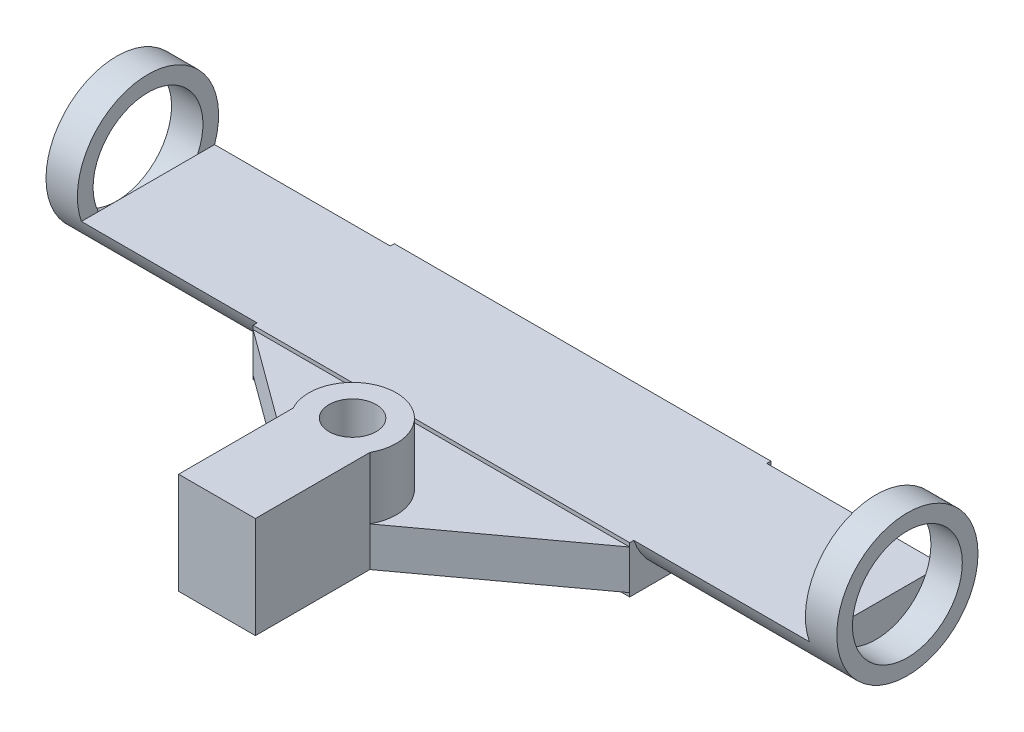
ISO-10303-21;
HEADER;
FILE_DESCRIPTION(('STEP AP214'),'2;1');
FILE_NAME('part.step','',(''),(''),'','','');
FILE_SCHEMA(('AUTOMOTIVE_DESIGN { 1 0 10303 214 1 1 1 1 }'));
ENDSEC;
DATA;
#1=APPLICATION_CONTEXT('core data for automotive mechanical design processes');
#2=APPLICATION_PROTOCOL_DEFINITION('international standard','automotive_design',2000,#1);
#3=PRODUCT_CONTEXT('',#1,'mechanical');
#4=PRODUCT('Part','Part','',(#3));
#5=PRODUCT_RELATED_PRODUCT_CATEGORY('part','',(#4));
#6=PRODUCT_DEFINITION_FORMATION('','',#4);
#7=PRODUCT_DEFINITION_CONTEXT('part definition',#1,'design');
#8=PRODUCT_DEFINITION('design','',#6,#7);
#9=PRODUCT_DEFINITION_SHAPE('','',#8);
#10=(LENGTH_UNIT() NAMED_UNIT(*) SI_UNIT(.MILLI.,.METRE.));
#11=(NAMED_UNIT(*) PLANE_ANGLE_UNIT() SI_UNIT($,.RADIAN.));
#12=(NAMED_UNIT(*) SI_UNIT($,.STERADIAN.) SOLID_ANGLE_UNIT());
#13=UNCERTAINTY_MEASURE_WITH_UNIT(LENGTH_MEASURE(1.E-05),#10,'distance_accuracy_value','');
#14=(GEOMETRIC_REPRESENTATION_CONTEXT(3) GLOBAL_UNCERTAINTY_ASSIGNED_CONTEXT((#13)) GLOBAL_UNIT_ASSIGNED_CONTEXT((#10,
#11,#12)) REPRESENTATION_CONTEXT('',''));
#15=CARTESIAN_POINT('',(0.,0.,0.));
#16=DIRECTION('',(0.,0.,1.));
#17=DIRECTION('',(1.,0.,0.));
#18=AXIS2_PLACEMENT_3D('',#15,#16,#17);
#19=CARTESIAN_POINT('',(59.217620347765,28.575,23.8423003272837));
#20=DIRECTION('',(0.,0.,-1.));
#21=DIRECTION('',(-1.,0.,0.));
#22=AXIS2_PLACEMENT_3D('',#19,#20,#21);
#23=PLANE('',#22);
#24=DIRECTION('',(0.,1.,0.));
#25=VECTOR('',#24,1.);
#26=CARTESIAN_POINT('',(-58.882379652235,28.575,23.8423003272837));
#27=LINE('',#26,#25);
#28=CARTESIAN_POINT('',(-58.882379652235,0.,23.8423003272837));
#29=VERTEX_POINT('',#28);
#30=CARTESIAN_POINT('',(-58.882379652235,0.762500000000017,23.8423003272837));
#31=VERTEX_POINT('',#30);
#32=EDGE_CURVE('E243',#29,#31,#27,.T.);
#33=ORIENTED_EDGE('',*,*,#32,.F.);
#34=DIRECTION('',(1.,0.,0.));
#35=VECTOR('',#34,1.);
#36=CARTESIAN_POINT('',(59.217620347765,0.,23.8423003272837));
#37=LINE('',#36,#35);
#38=CARTESIAN_POINT('',(17.317620347765,0.,23.8423003272837));
#39=VERTEX_POINT('',#38);
#40=EDGE_CURVE('E198',#29,#39,#37,.T.);
#41=ORIENTED_EDGE('',*,*,#40,.T.);
#42=DIRECTION('',(0.,-1.,0.));
#43=VECTOR('',#42,1.);
#44=CARTESIAN_POINT('',(17.317620347765,28.575,23.8423003272837));
#45=LINE('',#44,#43);
#46=CARTESIAN_POINT('',(17.317620347765,0.762500000000024,23.8423003272837));
#47=VERTEX_POINT('',#46);
#48=EDGE_CURVE('E259',#47,#39,#45,.T.);
#49=ORIENTED_EDGE('',*,*,#48,.F.);
#50=DIRECTION('',(1.,0.,0.));
#51=VECTOR('',#50,1.);
#52=CARTESIAN_POINT('',(17.317620347765,0.762500000000026,23.8423003272837));
#53=LINE('',#52,#51);
#54=EDGE_CURVE('E322',#31,#47,#53,.T.);
#55=ORIENTED_EDGE('',*,*,#54,.F.);
#56=EDGE_LOOP('',(#33,#41,#49,#55));
#57=FACE_BOUND('',#56,.T.);
#58=ADVANCED_FACE('F34',(#57),#23,.F.);
#59=CARTESIAN_POINT('',(-58.882379652235,8.76250000000002,23.8423003272837));
#60=VERTEX_POINT('',#59);
#61=CARTESIAN_POINT('',(-58.882379652235,9.525,23.8423003272837));
#62=VERTEX_POINT('',#61);
#63=EDGE_CURVE('E237',#60,#62,#27,.T.);
#64=ORIENTED_EDGE('',*,*,#63,.F.);
#65=DIRECTION('',(-1.,0.,0.));
#66=VECTOR('',#65,1.);
#67=CARTESIAN_POINT('',(17.317620347765,8.76250000000003,23.8423003272837));
#68=LINE('',#67,#66);
#69=CARTESIAN_POINT('',(17.317620347765,8.76250000000003,23.8423003272837));
#70=VERTEX_POINT('',#69);
#71=EDGE_CURVE('E185',#70,#60,#68,.T.);
#72=ORIENTED_EDGE('',*,*,#71,.F.);
#73=CARTESIAN_POINT('',(17.317620347765,9.525,23.8423003272837));
#74=VERTEX_POINT('',#73);
#75=EDGE_CURVE('E266',#74,#70,#45,.T.);
#76=ORIENTED_EDGE('',*,*,#75,.F.);
#77=DIRECTION('',(1.,0.,0.));
#78=VECTOR('',#77,1.);
#79=CARTESIAN_POINT('',(-94.432379652235,9.525,23.8423003272837));
#80=LINE('',#79,#78);
#81=EDGE_CURVE('E182',#62,#74,#80,.T.);
#82=ORIENTED_EDGE('',*,*,#81,.F.);
#83=EDGE_LOOP('',(#64,#72,#76,#82));
#84=FACE_BOUND('',#83,.T.);
#85=ADVANCED_FACE('F337',(#84),#23,.F.);
#86=CARTESIAN_POINT('',(59.217620347765,28.575,-4.73269967271635));
#87=DIRECTION('',(0.,0.,1.));
#88=DIRECTION('',(1.,0.,0.));
#89=AXIS2_PLACEMENT_3D('',#86,#87,#88);
#90=PLANE('',#89);
#91=DIRECTION('',(0.,-1.,0.));
#92=VECTOR('',#91,1.);
#93=CARTESIAN_POINT('',(-58.882379652235,28.575,-4.73269967271634));
#94=LINE('',#93,#92);
#95=CARTESIAN_POINT('',(-58.882379652235,9.525,-4.73269967271635));
#96=VERTEX_POINT('',#95);
#97=CARTESIAN_POINT('',(-58.882379652235,0.,-4.73269967271634));
#98=VERTEX_POINT('',#97);
#99=EDGE_CURVE('E247',#96,#98,#94,.T.);
#100=ORIENTED_EDGE('',*,*,#99,.F.);
#101=DIRECTION('',(-1.,0.,0.));
#102=VECTOR('',#101,1.);
#103=CARTESIAN_POINT('',(-94.432379652235,9.525,-4.73269967271635));
#104=LINE('',#103,#102);
#105=CARTESIAN_POINT('',(17.317620347765,9.525,-4.73269967271635));
#106=VERTEX_POINT('',#105);
#107=EDGE_CURVE('E192',#106,#96,#104,.T.);
#108=ORIENTED_EDGE('',*,*,#107,.F.);
#109=DIRECTION('',(0.,1.,0.));
#110=VECTOR('',#109,1.);
#111=CARTESIAN_POINT('',(17.317620347765,28.575,-4.73269967271635));
#112=LINE('',#111,#110);
#113=CARTESIAN_POINT('',(17.317620347765,0.,-4.73269967271635));
#114=VERTEX_POINT('',#113);
#115=EDGE_CURVE('E269',#114,#106,#112,.T.);
#116=ORIENTED_EDGE('',*,*,#115,.F.);
#117=DIRECTION('',(-1.,0.,0.));
#118=VECTOR('',#117,1.);
#119=CARTESIAN_POINT('',(59.217620347765,0.,-4.73269967271635));
#120=LINE('',#119,#118);
#121=EDGE_CURVE('E195',#114,#98,#120,.T.);
#122=ORIENTED_EDGE('',*,*,#121,.T.);
#123=EDGE_LOOP('',(#100,#108,#116,#122));
#124=FACE_BOUND('',#123,.T.);
#125=ADVANCED_FACE('F381',(#124),#90,.F.);
#126=CARTESIAN_POINT('',(0.,0.,0.));
#127=DIRECTION('',(0.,1.,0.));
#128=DIRECTION('',(0.,0.,1.));
#129=AXIS2_PLACEMENT_3D('',#126,#127,#128);
#130=PLANE('',#129);
#131=DIRECTION('',(0.,0.,1.));
#132=VECTOR('',#131,1.);
#133=CARTESIAN_POINT('',(-58.882379652235,0.,0.));
#134=LINE('',#133,#132);
#135=CARTESIAN_POINT('',(-58.882379652235,0.,9.55480032728367));
#136=VERTEX_POINT('',#135);
#137=EDGE_CURVE('E249',#98,#136,#134,.T.);
#138=ORIENTED_EDGE('',*,*,#137,.F.);
#139=ORIENTED_EDGE('',*,*,#121,.F.);
#140=DIRECTION('',(0.,0.,-1.));
#141=VECTOR('',#140,1.);
#142=CARTESIAN_POINT('',(17.317620347765,0.,0.));
#143=LINE('',#142,#141);
#144=CARTESIAN_POINT('',(17.317620347765,0.,9.55480032728365));
#145=VERTEX_POINT('',#144);
#146=EDGE_CURVE('E268',#145,#114,#143,.T.);
#147=ORIENTED_EDGE('',*,*,#146,.F.);
#148=EDGE_CURVE('E265',#39,#145,#143,.T.);
#149=ORIENTED_EDGE('',*,*,#148,.F.);
#150=ORIENTED_EDGE('',*,*,#40,.F.);
#151=EDGE_CURVE('E251',#136,#29,#134,.T.);
#152=ORIENTED_EDGE('',*,*,#151,.F.);
#153=EDGE_LOOP('',(#138,#139,#147,#149,#150,#152));
#154=FACE_BOUND('',#153,.T.);
#155=ADVANCED_FACE('F385',(#154),#130,.F.);
#156=CARTESIAN_POINT('',(0.,9.525,0.));
#157=DIRECTION('',(0.,1.,0.));
#158=DIRECTION('',(0.,0.,1.));
#159=AXIS2_PLACEMENT_3D('',#156,#157,#158);
#160=PLANE('',#159);
#161=ORIENTED_EDGE('',*,*,#107,.T.);
#162=DIRECTION('',(0.,0.,1.));
#163=VECTOR('',#162,1.);
#164=CARTESIAN_POINT('',(-58.882379652235,9.525,0.));
#165=LINE('',#164,#163);
#166=CARTESIAN_POINT('',(-58.882379652235,9.525,-3.91558385432006));
#167=VERTEX_POINT('',#166);
#168=EDGE_CURVE('E246',#96,#167,#165,.T.);
#169=ORIENTED_EDGE('',*,*,#168,.T.);
#170=DIRECTION('',(-1.,0.,0.));
#171=VECTOR('',#170,1.);
#172=CARTESIAN_POINT('',(-58.882379652235,9.525,-3.91558385432006));
#173=LINE('',#172,#171);
#174=CARTESIAN_POINT('',(-94.432379652235,9.525,-3.91558385432006));
#175=VERTEX_POINT('',#174);
#176=EDGE_CURVE('E254',#167,#175,#173,.T.);
#177=ORIENTED_EDGE('',*,*,#176,.T.);
#178=DIRECTION('',(0.,0.,1.));
#179=VECTOR('',#178,1.);
#180=CARTESIAN_POINT('',(-94.432379652235,9.525,-4.73269967271635));
#181=LINE('',#180,#179);
#182=CARTESIAN_POINT('',(-94.432379652235,9.525,-0.485431243750938));
#183=VERTEX_POINT('',#182);
#184=EDGE_CURVE('E178',#175,#183,#181,.T.);
#185=ORIENTED_EDGE('',*,*,#184,.T.);
#186=CARTESIAN_POINT('',(-94.432379652235,9.525,19.5950318983183));
#187=VERTEX_POINT('',#186);
#188=EDGE_CURVE('E168',#183,#187,#181,.T.);
#189=ORIENTED_EDGE('',*,*,#188,.T.);
#190=CARTESIAN_POINT('',(-94.432379652235,9.525,23.0251845088874));
#191=VERTEX_POINT('',#190);
#192=EDGE_CURVE('E171',#187,#191,#181,.T.);
#193=ORIENTED_EDGE('',*,*,#192,.T.);
#194=DIRECTION('',(-1.,0.,0.));
#195=VECTOR('',#194,1.);
#196=CARTESIAN_POINT('',(-58.882379652235,9.525,23.0251845088874));
#197=LINE('',#196,#195);
#198=CARTESIAN_POINT('',(-58.882379652235,9.525,23.0251845088874));
#199=VERTEX_POINT('',#198);
#200=EDGE_CURVE('E252',#191,#199,#197,.F.);
#201=ORIENTED_EDGE('',*,*,#200,.T.);
#202=EDGE_CURVE('E242',#199,#62,#165,.T.);
#203=ORIENTED_EDGE('',*,*,#202,.T.);
#204=ORIENTED_EDGE('',*,*,#81,.T.);
#205=DIRECTION('',(0.,0.,-1.));
#206=VECTOR('',#205,1.);
#207=CARTESIAN_POINT('',(17.317620347765,9.525,0.));
#208=LINE('',#207,#206);
#209=CARTESIAN_POINT('',(17.317620347765,9.525,23.0251845088874));
#210=VERTEX_POINT('',#209);
#211=EDGE_CURVE('E218',#74,#210,#208,.T.);
#212=ORIENTED_EDGE('',*,*,#211,.T.);
#213=DIRECTION('',(1.,0.,0.));
#214=VECTOR('',#213,1.);
#215=CARTESIAN_POINT('',(17.317620347765,9.525,23.0251845088874));
#216=LINE('',#215,#214);
#217=CARTESIAN_POINT('',(52.867620347765,9.525,23.0251845088874));
#218=VERTEX_POINT('',#217);
#219=EDGE_CURVE('E42',#210,#218,#216,.T.);
#220=ORIENTED_EDGE('',*,*,#219,.T.);
#221=DIRECTION('',(0.,0.,-1.));
#222=VECTOR('',#221,1.);
#223=CARTESIAN_POINT('',(52.867620347765,9.525,-4.73269967271635));
#224=LINE('',#223,#222);
#225=CARTESIAN_POINT('',(52.867620347765,9.525,19.5950318983183));
#226=VERTEX_POINT('',#225);
#227=EDGE_CURVE('E189',#218,#226,#224,.T.);
#228=ORIENTED_EDGE('',*,*,#227,.T.);
#229=CARTESIAN_POINT('',(52.867620347765,9.525,-0.485431243750955));
#230=VERTEX_POINT('',#229);
#231=EDGE_CURVE('E193',#226,#230,#224,.T.);
#232=ORIENTED_EDGE('',*,*,#231,.T.);
#233=CARTESIAN_POINT('',(52.867620347765,9.525,-3.91558385432008));
#234=VERTEX_POINT('',#233);
#235=EDGE_CURVE('E188',#230,#234,#224,.T.);
#236=ORIENTED_EDGE('',*,*,#235,.T.);
#237=DIRECTION('',(1.,0.,0.));
#238=VECTOR('',#237,1.);
#239=CARTESIAN_POINT('',(17.317620347765,9.525,-3.91558385432008));
#240=LINE('',#239,#238);
#241=CARTESIAN_POINT('',(17.317620347765,9.525,-3.91558385432008));
#242=VERTEX_POINT('',#241);
#243=EDGE_CURVE('E206',#234,#242,#240,.F.);
#244=ORIENTED_EDGE('',*,*,#243,.T.);
#245=EDGE_CURVE('E271',#242,#106,#208,.T.);
#246=ORIENTED_EDGE('',*,*,#245,.T.);
#247=EDGE_LOOP('',(#161,#169,#177,#185,#189,#193,#201,#203,#204,#212,#220,#228,#232,#236,#244,#246));
#248=FACE_BOUND('',#247,.T.);
#249=ADVANCED_FACE('F180',(#248),#160,.T.);
#250=CARTESIAN_POINT('',(-94.432379652235,9.525,-4.73269967271635));
#251=DIRECTION('',(-1.,0.,0.));
#252=DIRECTION('',(0.,0.,1.));
#253=AXIS2_PLACEMENT_3D('',#250,#251,#252);
#254=PLANE('',#253);
#255=ORIENTED_EDGE('',*,*,#192,.F.);
#256=CARTESIAN_POINT('',(-94.432379652235,14.2875,9.55480032728367));
#257=DIRECTION('',(-1.,0.,0.));
#258=DIRECTION('',(0.,0.,1.));
#259=AXIS2_PLACEMENT_3D('',#256,#257,#258);
#260=CIRCLE('',#259,11.1125);
#261=EDGE_CURVE('E156',#183,#187,#260,.F.);
#262=ORIENTED_EDGE('',*,*,#261,.F.);
#263=ORIENTED_EDGE('',*,*,#184,.F.);
#264=CARTESIAN_POINT('',(-94.432379652235,14.2875,9.55480032728367));
#265=DIRECTION('',(-1.,0.,0.));
#266=DIRECTION('',(0.,0.,1.));
#267=AXIS2_PLACEMENT_3D('',#264,#265,#266);
#268=CIRCLE('',#267,14.2875);
#269=EDGE_CURVE('E12',#191,#175,#268,.T.);
#270=ORIENTED_EDGE('',*,*,#269,.F.);
#271=EDGE_LOOP('',(#255,#262,#263,#270));
#272=FACE_BOUND('',#271,.T.);
#273=ADVANCED_FACE('F172',(#272),#254,.F.);
#274=CARTESIAN_POINT('',(52.867620347765,9.525,-4.73269967271635));
#275=DIRECTION('',(1.,0.,0.));
#276=DIRECTION('',(0.,0.,-1.));
#277=AXIS2_PLACEMENT_3D('',#274,#275,#276);
#278=PLANE('',#277);
#279=ORIENTED_EDGE('',*,*,#235,.F.);
#280=CARTESIAN_POINT('',(52.867620347765,14.2875,9.55480032728365));
#281=DIRECTION('',(1.,0.,0.));
#282=DIRECTION('',(0.,0.,-1.));
#283=AXIS2_PLACEMENT_3D('',#280,#281,#282);
#284=CIRCLE('',#283,11.1125);
#285=EDGE_CURVE('E228',#226,#230,#284,.F.);
#286=ORIENTED_EDGE('',*,*,#285,.F.);
#287=ORIENTED_EDGE('',*,*,#227,.F.);
#288=CARTESIAN_POINT('',(52.867620347765,14.2875,9.55480032728365));
#289=DIRECTION('',(1.,0.,0.));
#290=DIRECTION('',(0.,0.,-1.));
#291=AXIS2_PLACEMENT_3D('',#288,#289,#290);
#292=CIRCLE('',#291,14.2875);
#293=EDGE_CURVE('E211',#234,#218,#292,.T.);
#294=ORIENTED_EDGE('',*,*,#293,.F.);
#295=EDGE_LOOP('',(#279,#286,#287,#294));
#296=FACE_BOUND('',#295,.T.);
#297=ADVANCED_FACE('F226',(#296),#278,.F.);
#298=CARTESIAN_POINT('',(17.317620347765,8.76250000000003,69.2423003272837));
#299=DIRECTION('',(0.,-1.,0.));
#300=DIRECTION('',(1.,0.,0.));
#301=AXIS2_PLACEMENT_3D('',#298,#299,#300);
#302=PLANE('',#301);
#303=CARTESIAN_POINT('',(-20.782379652235,8.76250000000002,41.8150044188641));
#304=DIRECTION('',(0.,1.,0.));
#305=DIRECTION('',(-1.,0.,0.));
#306=AXIS2_PLACEMENT_3D('',#303,#304,#305);
#307=CIRCLE('',#306,8.86020409158041);
#308=CARTESIAN_POINT('',(-13.0139213717516,8.76250000000002,46.0757875028578));
#309=VERTEX_POINT('',#308);
#310=CARTESIAN_POINT('',(-28.5508379327184,8.76250000000002,46.0757875028578));
#311=VERTEX_POINT('',#310);
#312=EDGE_CURVE('E277',#309,#311,#307,.T.);
#313=ORIENTED_EDGE('',*,*,#312,.F.);
#314=DIRECTION('',(-0.806527260869814,0.,0.591196902456225));
#315=VECTOR('',#314,1.);
#316=CARTESIAN_POINT('',(17.4211471524276,8.76250000000003,23.7664135851892));
#317=LINE('',#316,#315);
#318=EDGE_CURVE('E306',#70,#309,#317,.T.);
#319=ORIENTED_EDGE('',*,*,#318,.F.);
#320=ORIENTED_EDGE('',*,*,#71,.T.);
#321=DIRECTION('',(0.806527260869815,0.,0.591196902456224));
#322=VECTOR('',#321,1.);
#323=CARTESIAN_POINT('',(-31.9486031867236,8.76250000000002,43.5851732472716));
#324=LINE('',#323,#322);
#325=EDGE_CURVE('E297',#60,#311,#324,.T.);
#326=ORIENTED_EDGE('',*,*,#325,.T.);
#327=EDGE_LOOP('',(#313,#319,#320,#326));
#328=FACE_BOUND('',#327,.T.);
#329=ADVANCED_FACE('F332',(#328),#302,.F.);
#330=CARTESIAN_POINT('',(17.317620347765,0.762500000000026,69.2423003272837));
#331=DIRECTION('',(0.,1.,0.));
#332=DIRECTION('',(-1.,0.,0.));
#333=AXIS2_PLACEMENT_3D('',#330,#331,#332);
#334=PLANE('',#333);
#335=CARTESIAN_POINT('',(-20.782379652235,0.762500000000021,41.8150044188641));
#336=DIRECTION('',(0.,1.,0.));
#337=DIRECTION('',(-1.,0.,0.));
#338=AXIS2_PLACEMENT_3D('',#335,#336,#337);
#339=CIRCLE('',#338,4.7625);
#340=CARTESIAN_POINT('',(-25.544879652235,0.762500000000021,41.8150044188641));
#341=VERTEX_POINT('',#340);
#342=EDGE_CURVE('E207',#341,#341,#339,.T.);
#343=ORIENTED_EDGE('',*,*,#342,.T.);
#344=EDGE_LOOP('',(#343));
#345=FACE_BOUND('',#344,.T.);
#346=DIRECTION('',(0.806527260869814,0.,0.591196902456224));
#347=VECTOR('',#346,1.);
#348=CARTESIAN_POINT('',(12.3321358983811,0.762500000000025,76.0436369045983));
#349=LINE('',#348,#347);
#350=CARTESIAN_POINT('',(-28.5508379327184,0.76250000000002,46.0757875028578));
#351=VERTEX_POINT('',#350);
#352=EDGE_CURVE('E304',#31,#351,#349,.T.);
#353=ORIENTED_EDGE('',*,*,#352,.F.);
#354=ORIENTED_EDGE('',*,*,#54,.T.);
#355=DIRECTION('',(-0.806527260869814,0.,0.591196902456225));
#356=VECTOR('',#355,1.);
#357=CARTESIAN_POINT('',(-4.3298450463573,0.762500000000023,39.7102258245958));
#358=LINE('',#357,#356);
#359=CARTESIAN_POINT('',(-13.0139213717516,0.762500000000024,46.0757875028578));
#360=VERTEX_POINT('',#359);
#361=EDGE_CURVE('E315',#47,#360,#358,.T.);
#362=ORIENTED_EDGE('',*,*,#361,.T.);
#363=DIRECTION('',(0.,0.,1.));
#364=VECTOR('',#363,1.);
#365=CARTESIAN_POINT('',(-13.0139213717516,0.762500000000022,69.2423003272837));
#366=LINE('',#365,#364);
#367=CARTESIAN_POINT('',(-13.0139213717516,0.762500000000017,69.2423003272837));
#368=VERTEX_POINT('',#367);
#369=EDGE_CURVE('E312',#360,#368,#366,.T.);
#370=ORIENTED_EDGE('',*,*,#369,.T.);
#371=DIRECTION('',(1.,0.,0.));
#372=VECTOR('',#371,1.);
#373=CARTESIAN_POINT('',(17.317620347765,0.762500000000026,69.2423003272837));
#374=LINE('',#373,#372);
#375=CARTESIAN_POINT('',(-28.5508379327184,0.76250000000002,69.2423003272837));
#376=VERTEX_POINT('',#375);
#377=EDGE_CURVE('E176',#376,#368,#374,.T.);
#378=ORIENTED_EDGE('',*,*,#377,.F.);
#379=DIRECTION('',(0.,0.,1.));
#380=VECTOR('',#379,1.);
#381=CARTESIAN_POINT('',(-28.5508379327184,0.76250000000002,69.2423003272837));
#382=LINE('',#381,#380);
#383=EDGE_CURVE('E302',#351,#376,#382,.T.);
#384=ORIENTED_EDGE('',*,*,#383,.F.);
#385=EDGE_LOOP('',(#353,#354,#362,#370,#378,#384));
#386=FACE_BOUND('',#385,.T.);
#387=ADVANCED_FACE('F350',(#345,#386),#334,.F.);
#388=CARTESIAN_POINT('',(0.,0.,69.2423003272837));
#389=DIRECTION('',(0.,0.,1.));
#390=DIRECTION('',(1.,0.,0.));
#391=AXIS2_PLACEMENT_3D('',#388,#389,#390);
#392=PLANE('',#391);
#393=DIRECTION('',(0.,-1.,0.));
#394=VECTOR('',#393,1.);
#395=CARTESIAN_POINT('',(-13.0139213717516,0.,69.2423003272837));
#396=LINE('',#395,#394);
#397=CARTESIAN_POINT('',(-13.0139213717516,21.2875,69.2423003272837));
#398=VERTEX_POINT('',#397);
#399=EDGE_CURVE('E200',#398,#368,#396,.T.);
#400=ORIENTED_EDGE('',*,*,#399,.F.);
#401=DIRECTION('',(1.,0.,0.));
#402=VECTOR('',#401,1.);
#403=CARTESIAN_POINT('',(-28.5508379327184,21.2875,69.2423003272837));
#404=LINE('',#403,#402);
#405=CARTESIAN_POINT('',(-28.5508379327184,21.2875,69.2423003272837));
#406=VERTEX_POINT('',#405);
#407=EDGE_CURVE('E284',#406,#398,#404,.T.);
#408=ORIENTED_EDGE('',*,*,#407,.F.);
#409=DIRECTION('',(0.,-1.,0.));
#410=VECTOR('',#409,1.);
#411=CARTESIAN_POINT('',(-28.5508379327184,0.,69.2423003272837));
#412=LINE('',#411,#410);
#413=EDGE_CURVE('E203',#406,#376,#412,.T.);
#414=ORIENTED_EDGE('',*,*,#413,.T.);
#415=ORIENTED_EDGE('',*,*,#377,.T.);
#416=EDGE_LOOP('',(#400,#408,#414,#415));
#417=FACE_BOUND('',#416,.T.);
#418=ADVANCED_FACE('F353',(#417),#392,.T.);
#419=CARTESIAN_POINT('',(17.4211471524276,0.,23.7664135851892));
#420=DIRECTION('',(-0.591196902456225,0.,-0.806527260869814));
#421=DIRECTION('',(-0.806527260869814,0.,0.591196902456225));
#422=AXIS2_PLACEMENT_3D('',#419,#420,#421);
#423=PLANE('',#422);
#424=DIRECTION('',(0.,1.,0.));
#425=VECTOR('',#424,1.);
#426=CARTESIAN_POINT('',(17.317620347765,0.762500000000026,23.8423003272837));
#427=LINE('',#426,#425);
#428=EDGE_CURVE('E324',#47,#70,#427,.T.);
#429=ORIENTED_EDGE('',*,*,#428,.T.);
#430=ORIENTED_EDGE('',*,*,#318,.T.);
#431=DIRECTION('',(0.,1.,0.));
#432=VECTOR('',#431,1.);
#433=CARTESIAN_POINT('',(-13.0139213717516,0.,46.0757875028578));
#434=LINE('',#433,#432);
#435=EDGE_CURVE('E309',#360,#309,#434,.T.);
#436=ORIENTED_EDGE('',*,*,#435,.F.);
#437=ORIENTED_EDGE('',*,*,#361,.F.);
#438=EDGE_LOOP('',(#429,#430,#436,#437));
#439=FACE_BOUND('',#438,.T.);
#440=ADVANCED_FACE('F366',(#439),#423,.F.);
#441=CARTESIAN_POINT('',(-13.0139213717516,0.,0.));
#442=DIRECTION('',(-1.,0.,0.));
#443=DIRECTION('',(0.,0.,1.));
#444=AXIS2_PLACEMENT_3D('',#441,#442,#443);
#445=PLANE('',#444);
#446=ORIENTED_EDGE('',*,*,#435,.T.);
#447=DIRECTION('',(0.,-1.,0.));
#448=VECTOR('',#447,1.);
#449=CARTESIAN_POINT('',(-13.0139213717516,21.2875,46.0757875028578));
#450=LINE('',#449,#448);
#451=CARTESIAN_POINT('',(-13.0139213717516,21.2875,46.0757875028578));
#452=VERTEX_POINT('',#451);
#453=EDGE_CURVE('E289',#452,#309,#450,.T.);
#454=ORIENTED_EDGE('',*,*,#453,.F.);
#455=DIRECTION('',(0.,0.,-1.));
#456=VECTOR('',#455,1.);
#457=CARTESIAN_POINT('',(-13.0139213717516,21.2875,69.2423003272837));
#458=LINE('',#457,#456);
#459=EDGE_CURVE('E287',#398,#452,#458,.T.);
#460=ORIENTED_EDGE('',*,*,#459,.F.);
#461=ORIENTED_EDGE('',*,*,#399,.T.);
#462=ORIENTED_EDGE('',*,*,#369,.F.);
#463=EDGE_LOOP('',(#446,#454,#460,#461,#462));
#464=FACE_BOUND('',#463,.T.);
#465=ADVANCED_FACE('F357',(#464),#445,.F.);
#466=CARTESIAN_POINT('',(-31.9486031867236,0.,43.5851732472716));
#467=DIRECTION('',(-0.591196902456224,0.,0.806527260869814));
#468=DIRECTION('',(0.806527260869814,0.,0.591196902456224));
#469=AXIS2_PLACEMENT_3D('',#466,#467,#468);
#470=PLANE('',#469);
#471=ORIENTED_EDGE('',*,*,#352,.T.);
#472=DIRECTION('',(0.,1.,0.));
#473=VECTOR('',#472,1.);
#474=CARTESIAN_POINT('',(-28.5508379327184,0.,46.0757875028578));
#475=LINE('',#474,#473);
#476=EDGE_CURVE('E300',#351,#311,#475,.T.);
#477=ORIENTED_EDGE('',*,*,#476,.T.);
#478=ORIENTED_EDGE('',*,*,#325,.F.);
#479=DIRECTION('',(0.,-1.,0.));
#480=VECTOR('',#479,1.);
#481=CARTESIAN_POINT('',(-58.882379652235,0.762500000000017,23.8423003272837));
#482=LINE('',#481,#480);
#483=EDGE_CURVE('E318',#60,#31,#482,.T.);
#484=ORIENTED_EDGE('',*,*,#483,.T.);
#485=EDGE_LOOP('',(#471,#477,#478,#484));
#486=FACE_BOUND('',#485,.T.);
#487=ADVANCED_FACE('F341',(#486),#470,.T.);
#488=CARTESIAN_POINT('',(-28.5508379327184,0.,0.));
#489=DIRECTION('',(-1.,0.,0.));
#490=DIRECTION('',(0.,0.,1.));
#491=AXIS2_PLACEMENT_3D('',#488,#489,#490);
#492=PLANE('',#491);
#493=ORIENTED_EDGE('',*,*,#383,.T.);
#494=ORIENTED_EDGE('',*,*,#413,.F.);
#495=DIRECTION('',(0.,0.,1.));
#496=VECTOR('',#495,1.);
#497=CARTESIAN_POINT('',(-28.5508379327184,21.2875,46.0757875028578));
#498=LINE('',#497,#496);
#499=CARTESIAN_POINT('',(-28.5508379327184,21.2875,46.0757875028578));
#500=VERTEX_POINT('',#499);
#501=EDGE_CURVE('E281',#500,#406,#498,.T.);
#502=ORIENTED_EDGE('',*,*,#501,.F.);
#503=DIRECTION('',(0.,-1.,0.));
#504=VECTOR('',#503,1.);
#505=CARTESIAN_POINT('',(-28.5508379327184,21.2875,46.0757875028578));
#506=LINE('',#505,#504);
#507=EDGE_CURVE('E294',#500,#311,#506,.T.);
#508=ORIENTED_EDGE('',*,*,#507,.T.);
#509=ORIENTED_EDGE('',*,*,#476,.F.);
#510=EDGE_LOOP('',(#493,#494,#502,#508,#509));
#511=FACE_BOUND('',#510,.T.);
#512=ADVANCED_FACE('F346',(#511),#492,.T.);
#513=CARTESIAN_POINT('',(-20.782379652235,21.2875,41.8150044188641));
#514=DIRECTION('',(0.,1.,0.));
#515=DIRECTION('',(-1.,0.,0.));
#516=AXIS2_PLACEMENT_3D('',#513,#514,#515);
#517=PLANE('',#516);
#518=CARTESIAN_POINT('',(-20.782379652235,21.2875,41.8150044188641));
#519=DIRECTION('',(0.,1.,0.));
#520=DIRECTION('',(-1.,0.,0.));
#521=AXIS2_PLACEMENT_3D('',#518,#519,#520);
#522=CIRCLE('',#521,8.86020409158041);
#523=EDGE_CURVE('E278',#452,#500,#522,.T.);
#524=ORIENTED_EDGE('',*,*,#523,.T.);
#525=ORIENTED_EDGE('',*,*,#501,.T.);
#526=ORIENTED_EDGE('',*,*,#407,.T.);
#527=ORIENTED_EDGE('',*,*,#459,.T.);
#528=EDGE_LOOP('',(#524,#525,#526,#527));
#529=FACE_BOUND('',#528,.T.);
#530=CARTESIAN_POINT('',(-20.782379652235,21.2875,41.8150044188641));
#531=DIRECTION('',(0.,1.,0.));
#532=DIRECTION('',(-1.,0.,0.));
#533=AXIS2_PLACEMENT_3D('',#530,#531,#532);
#534=CIRCLE('',#533,4.7625);
#535=CARTESIAN_POINT('',(-25.544879652235,21.2875,41.8150044188641));
#536=VERTEX_POINT('',#535);
#537=EDGE_CURVE('E210',#536,#536,#534,.T.);
#538=ORIENTED_EDGE('',*,*,#537,.F.);
#539=EDGE_LOOP('',(#538));
#540=FACE_BOUND('',#539,.T.);
#541=ADVANCED_FACE('F362',(#529,#540),#517,.T.);
#542=CARTESIAN_POINT('',(-20.782379652235,21.2875,41.8150044188641));
#543=DIRECTION('',(0.,-1.,0.));
#544=DIRECTION('',(1.,0.,0.));
#545=AXIS2_PLACEMENT_3D('',#542,#543,#544);
#546=CYLINDRICAL_SURFACE('',#545,8.86020409158041);
#547=ORIENTED_EDGE('',*,*,#312,.T.);
#548=ORIENTED_EDGE('',*,*,#507,.F.);
#549=ORIENTED_EDGE('',*,*,#523,.F.);
#550=ORIENTED_EDGE('',*,*,#453,.T.);
#551=EDGE_LOOP('',(#547,#548,#549,#550));
#552=FACE_BOUND('',#551,.T.);
#553=ADVANCED_FACE('F365',(#552),#546,.T.);
#554=CARTESIAN_POINT('',(-20.782379652235,21.2875,41.8150044188641));
#555=DIRECTION('',(0.,-1.,0.));
#556=DIRECTION('',(1.,0.,0.));
#557=AXIS2_PLACEMENT_3D('',#554,#555,#556);
#558=CYLINDRICAL_SURFACE('',#557,4.7625);
#559=ORIENTED_EDGE('',*,*,#537,.T.);
#560=EDGE_LOOP('',(#559));
#561=FACE_BOUND('',#560,.T.);
#562=ORIENTED_EDGE('',*,*,#342,.F.);
#563=EDGE_LOOP('',(#562));
#564=FACE_BOUND('',#563,.T.);
#565=ADVANCED_FACE('F429',(#561,#564),#558,.F.);
#566=CARTESIAN_POINT('',(17.317620347765,14.2875,9.55480032728365));
#567=DIRECTION('',(1.,0.,0.));
#568=DIRECTION('',(0.,0.,-1.));
#569=AXIS2_PLACEMENT_3D('',#566,#567,#568);
#570=CYLINDRICAL_SURFACE('',#569,14.2875);
#571=CARTESIAN_POINT('',(59.217620347765,14.2875,9.55480032728365));
#572=DIRECTION('',(1.,0.,0.));
#573=DIRECTION('',(0.,0.,-1.));
#574=AXIS2_PLACEMENT_3D('',#571,#572,#573);
#575=CIRCLE('',#574,14.2875);
#576=CARTESIAN_POINT('',(59.217620347765,14.2875,-4.73269967271635));
#577=VERTEX_POINT('',#576);
#578=EDGE_CURVE('E256',#577,#577,#575,.T.);
#579=ORIENTED_EDGE('',*,*,#578,.F.);
#580=EDGE_LOOP('',(#579));
#581=FACE_BOUND('',#580,.T.);
#582=ORIENTED_EDGE('',*,*,#293,.T.);
#583=ORIENTED_EDGE('',*,*,#219,.F.);
#584=CARTESIAN_POINT('',(17.317620347765,14.2875,9.55480032728365));
#585=DIRECTION('',(1.,0.,0.));
#586=DIRECTION('',(0.,0.,-1.));
#587=AXIS2_PLACEMENT_3D('',#584,#585,#586);
#588=CIRCLE('',#587,14.2875);
#589=EDGE_CURVE('E257',#210,#145,#588,.T.);
#590=ORIENTED_EDGE('',*,*,#589,.T.);
#591=EDGE_CURVE('E260',#145,#242,#588,.T.);
#592=ORIENTED_EDGE('',*,*,#591,.T.);
#593=ORIENTED_EDGE('',*,*,#243,.F.);
#594=EDGE_LOOP('',(#582,#583,#590,#592,#593));
#595=FACE_BOUND('',#594,.T.);
#596=ADVANCED_FACE('F409',(#581,#595),#570,.T.);
#597=CARTESIAN_POINT('',(17.317620347765,14.2875,32.2548003272836));
#598=DIRECTION('',(1.,0.,0.));
#599=DIRECTION('',(0.,0.,-1.));
#600=AXIS2_PLACEMENT_3D('',#597,#598,#599);
#601=PLANE('',#600);
#602=ORIENTED_EDGE('',*,*,#75,.T.);
#603=ORIENTED_EDGE('',*,*,#428,.F.);
#604=ORIENTED_EDGE('',*,*,#48,.T.);
#605=ORIENTED_EDGE('',*,*,#148,.T.);
#606=ORIENTED_EDGE('',*,*,#589,.F.);
#607=ORIENTED_EDGE('',*,*,#211,.F.);
#608=EDGE_LOOP('',(#602,#603,#604,#605,#606,#607));
#609=FACE_BOUND('',#608,.T.);
#610=ADVANCED_FACE('F421',(#609),#601,.T.);
#611=ORIENTED_EDGE('',*,*,#591,.F.);
#612=ORIENTED_EDGE('',*,*,#146,.T.);
#613=ORIENTED_EDGE('',*,*,#115,.T.);
#614=ORIENTED_EDGE('',*,*,#245,.F.);
#615=EDGE_LOOP('',(#611,#612,#613,#614));
#616=FACE_BOUND('',#615,.T.);
#617=ADVANCED_FACE('F408',(#616),#601,.T.);
#618=CARTESIAN_POINT('',(59.217620347765,28.575,23.8423003272837));
#619=DIRECTION('',(-1.,0.,0.));
#620=DIRECTION('',(0.,0.,1.));
#621=AXIS2_PLACEMENT_3D('',#618,#619,#620);
#622=PLANE('',#621);
#623=CARTESIAN_POINT('',(59.217620347765,14.2875,9.55480032728365));
#624=DIRECTION('',(1.,0.,0.));
#625=DIRECTION('',(0.,0.,-1.));
#626=AXIS2_PLACEMENT_3D('',#623,#624,#625);
#627=CIRCLE('',#626,11.1125);
#628=CARTESIAN_POINT('',(59.217620347765,14.2875,-1.55769967271635));
#629=VERTEX_POINT('',#628);
#630=EDGE_CURVE('E169',#629,#629,#627,.T.);
#631=ORIENTED_EDGE('',*,*,#630,.F.);
#632=EDGE_LOOP('',(#631));
#633=FACE_BOUND('',#632,.T.);
#634=ORIENTED_EDGE('',*,*,#578,.T.);
#635=EDGE_LOOP('',(#634));
#636=FACE_BOUND('',#635,.T.);
#637=ADVANCED_FACE('F36',(#633,#636),#622,.F.);
#638=CARTESIAN_POINT('',(-58.882379652235,14.2875,9.55480032728367));
#639=DIRECTION('',(-1.,0.,0.));
#640=DIRECTION('',(0.,0.,1.));
#641=AXIS2_PLACEMENT_3D('',#638,#639,#640);
#642=CYLINDRICAL_SURFACE('',#641,14.2875);
#643=CARTESIAN_POINT('',(-100.782379652235,14.2875,9.55480032728367));
#644=DIRECTION('',(-1.,0.,0.));
#645=DIRECTION('',(0.,0.,1.));
#646=AXIS2_PLACEMENT_3D('',#643,#644,#645);
#647=CIRCLE('',#646,14.2875);
#648=CARTESIAN_POINT('',(-100.782379652235,14.2875,23.8423003272837));
#649=VERTEX_POINT('',#648);
#650=EDGE_CURVE('E230',#649,#649,#647,.T.);
#651=ORIENTED_EDGE('',*,*,#650,.F.);
#652=EDGE_LOOP('',(#651));
#653=FACE_BOUND('',#652,.T.);
#654=ORIENTED_EDGE('',*,*,#269,.T.);
#655=ORIENTED_EDGE('',*,*,#176,.F.);
#656=CARTESIAN_POINT('',(-58.882379652235,14.2875,9.55480032728367));
#657=DIRECTION('',(-1.,0.,0.));
#658=DIRECTION('',(0.,0.,1.));
#659=AXIS2_PLACEMENT_3D('',#656,#657,#658);
#660=CIRCLE('',#659,14.2875);
#661=EDGE_CURVE('E234',#167,#136,#660,.T.);
#662=ORIENTED_EDGE('',*,*,#661,.T.);
#663=EDGE_CURVE('E238',#136,#199,#660,.T.);
#664=ORIENTED_EDGE('',*,*,#663,.T.);
#665=ORIENTED_EDGE('',*,*,#200,.F.);
#666=EDGE_LOOP('',(#654,#655,#662,#664,#665));
#667=FACE_BOUND('',#666,.T.);
#668=ADVANCED_FACE('F420',(#653,#667),#642,.T.);
#669=CARTESIAN_POINT('',(-58.882379652235,14.2875,32.2548003272836));
#670=DIRECTION('',(-1.,0.,0.));
#671=DIRECTION('',(0.,0.,1.));
#672=AXIS2_PLACEMENT_3D('',#669,#670,#671);
#673=PLANE('',#672);
#674=ORIENTED_EDGE('',*,*,#32,.T.);
#675=ORIENTED_EDGE('',*,*,#483,.F.);
#676=ORIENTED_EDGE('',*,*,#63,.T.);
#677=ORIENTED_EDGE('',*,*,#202,.F.);
#678=ORIENTED_EDGE('',*,*,#663,.F.);
#679=ORIENTED_EDGE('',*,*,#151,.T.);
#680=EDGE_LOOP('',(#674,#675,#676,#677,#678,#679));
#681=FACE_BOUND('',#680,.T.);
#682=ADVANCED_FACE('F418',(#681),#673,.T.);
#683=ORIENTED_EDGE('',*,*,#137,.T.);
#684=ORIENTED_EDGE('',*,*,#661,.F.);
#685=ORIENTED_EDGE('',*,*,#168,.F.);
#686=ORIENTED_EDGE('',*,*,#99,.T.);
#687=EDGE_LOOP('',(#683,#684,#685,#686));
#688=FACE_BOUND('',#687,.T.);
#689=ADVANCED_FACE('F390',(#688),#673,.T.);
#690=CARTESIAN_POINT('',(-100.782379652235,28.575,23.8423003272837));
#691=DIRECTION('',(1.,0.,0.));
#692=DIRECTION('',(0.,0.,-1.));
#693=AXIS2_PLACEMENT_3D('',#690,#691,#692);
#694=PLANE('',#693);
#695=CARTESIAN_POINT('',(-100.782379652235,14.2875,9.55480032728367));
#696=DIRECTION('',(-1.,0.,0.));
#697=DIRECTION('',(0.,0.,1.));
#698=AXIS2_PLACEMENT_3D('',#695,#696,#697);
#699=CIRCLE('',#698,11.1125);
#700=CARTESIAN_POINT('',(-100.782379652235,14.2875,20.6673003272837));
#701=VERTEX_POINT('',#700);
#702=EDGE_CURVE('E163',#701,#701,#699,.T.);
#703=ORIENTED_EDGE('',*,*,#702,.F.);
#704=EDGE_LOOP('',(#703));
#705=FACE_BOUND('',#704,.T.);
#706=ORIENTED_EDGE('',*,*,#650,.T.);
#707=EDGE_LOOP('',(#706));
#708=FACE_BOUND('',#707,.T.);
#709=ADVANCED_FACE('F387',(#705,#708),#694,.F.);
#710=CARTESIAN_POINT('',(21.4367239240229,14.2875,9.55480032728365));
#711=DIRECTION('',(1.,0.,0.));
#712=DIRECTION('',(0.,0.,-1.));
#713=AXIS2_PLACEMENT_3D('',#710,#711,#712);
#714=CYLINDRICAL_SURFACE('',#713,11.1125);
#715=EDGE_CURVE('E55',#230,#226,#284,.F.);
#716=ORIENTED_EDGE('',*,*,#715,.T.);
#717=ORIENTED_EDGE('',*,*,#285,.T.);
#718=EDGE_LOOP('',(#716,#717));
#719=FACE_BOUND('',#718,.T.);
#720=ORIENTED_EDGE('',*,*,#630,.T.);
#721=EDGE_LOOP('',(#720));
#722=FACE_BOUND('',#721,.T.);
#723=ADVANCED_FACE('F389',(#719,#722),#714,.F.);
#724=CARTESIAN_POINT('',(52.867620347765,9.525,-4.73269967271635));
#725=DIRECTION('',(1.,0.,0.));
#726=DIRECTION('',(0.,0.,-1.));
#727=AXIS2_PLACEMENT_3D('',#724,#725,#726);
#728=PLANE('',#727);
#729=ORIENTED_EDGE('',*,*,#715,.F.);
#730=ORIENTED_EDGE('',*,*,#231,.F.);
#731=EDGE_LOOP('',(#729,#730));
#732=FACE_BOUND('',#731,.T.);
#733=ADVANCED_FACE('F577',(#732),#728,.T.);
#734=CARTESIAN_POINT('',(-63.001483228493,14.2875,9.55480032728367));
#735=DIRECTION('',(-1.,0.,0.));
#736=DIRECTION('',(0.,0.,1.));
#737=AXIS2_PLACEMENT_3D('',#734,#735,#736);
#738=CYLINDRICAL_SURFACE('',#737,11.1125);
#739=EDGE_CURVE('E48',#187,#183,#260,.F.);
#740=ORIENTED_EDGE('',*,*,#739,.T.);
#741=ORIENTED_EDGE('',*,*,#261,.T.);
#742=EDGE_LOOP('',(#740,#741));
#743=FACE_BOUND('',#742,.T.);
#744=ORIENTED_EDGE('',*,*,#702,.T.);
#745=EDGE_LOOP('',(#744));
#746=FACE_BOUND('',#745,.T.);
#747=ADVANCED_FACE('F157',(#743,#746),#738,.F.);
#748=CARTESIAN_POINT('',(-94.432379652235,9.525,-4.73269967271635));
#749=DIRECTION('',(-1.,0.,0.));
#750=DIRECTION('',(0.,0.,1.));
#751=AXIS2_PLACEMENT_3D('',#748,#749,#750);
#752=PLANE('',#751);
#753=ORIENTED_EDGE('',*,*,#739,.F.);
#754=ORIENTED_EDGE('',*,*,#188,.F.);
#755=EDGE_LOOP('',(#753,#754));
#756=FACE_BOUND('',#755,.T.);
#757=ADVANCED_FACE('F166',(#756),#752,.T.);
#758=CLOSED_SHELL('',(#58,#85,#125,#155,#249,#273,#297,#329,#387,#418,#440,#465,#487,#512,#541,
#553,#565,#596,#610,#617,#637,#668,#682,#689,#709,#723,#733,#747,#757));
#759=MANIFOLD_SOLID_BREP('B2',#758);
#760=ADVANCED_BREP_SHAPE_REPRESENTATION('',(#18,#759),#14);
#761=SHAPE_DEFINITION_REPRESENTATION(#9,#760);
ENDSEC;
END-ISO-10303-21;
